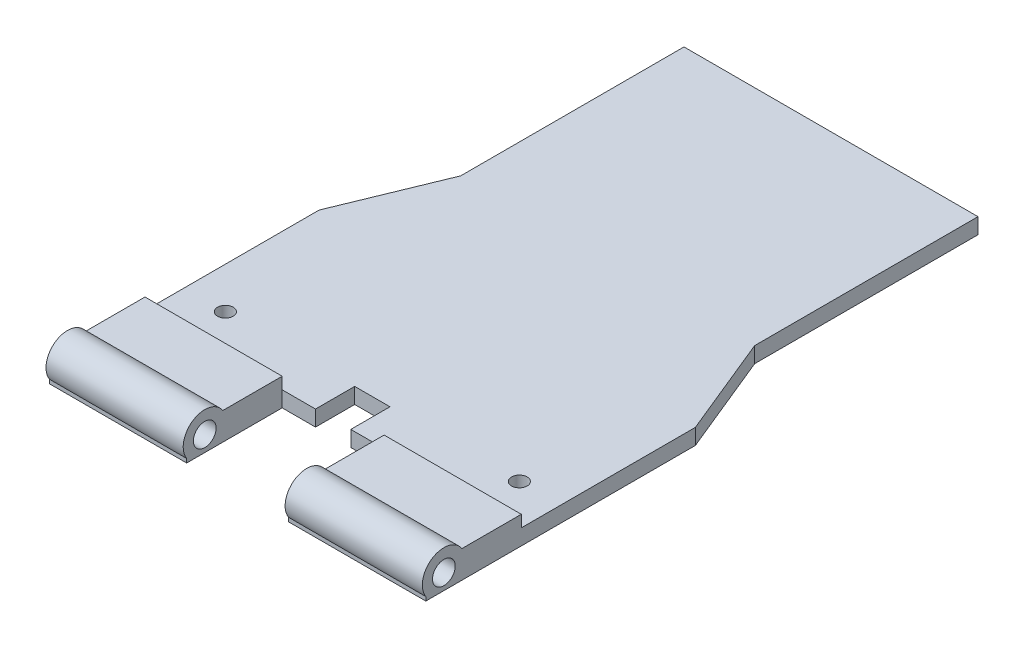
ISO-10303-21;
HEADER;
FILE_DESCRIPTION(('STEP AP214'),'2;1');
FILE_NAME('part.step','',(''),(''),'','','');
FILE_SCHEMA(('AUTOMOTIVE_DESIGN { 1 0 10303 214 1 1 1 1 }'));
ENDSEC;
DATA;
#1=APPLICATION_CONTEXT('core data for automotive mechanical design processes');
#2=APPLICATION_PROTOCOL_DEFINITION('international standard','automotive_design',2000,#1);
#3=PRODUCT_CONTEXT('',#1,'mechanical');
#4=PRODUCT('Part','Part','',(#3));
#5=PRODUCT_RELATED_PRODUCT_CATEGORY('part','',(#4));
#6=PRODUCT_DEFINITION_FORMATION('','',#4);
#7=PRODUCT_DEFINITION_CONTEXT('part definition',#1,'design');
#8=PRODUCT_DEFINITION('design','',#6,#7);
#9=PRODUCT_DEFINITION_SHAPE('','',#8);
#10=(LENGTH_UNIT() NAMED_UNIT(*) SI_UNIT(.MILLI.,.METRE.));
#11=(NAMED_UNIT(*) PLANE_ANGLE_UNIT() SI_UNIT($,.RADIAN.));
#12=(NAMED_UNIT(*) SI_UNIT($,.STERADIAN.) SOLID_ANGLE_UNIT());
#13=UNCERTAINTY_MEASURE_WITH_UNIT(LENGTH_MEASURE(1.E-05),#10,'distance_accuracy_value','');
#14=(GEOMETRIC_REPRESENTATION_CONTEXT(3) GLOBAL_UNCERTAINTY_ASSIGNED_CONTEXT((#13)) GLOBAL_UNIT_ASSIGNED_CONTEXT((#10,
#11,#12)) REPRESENTATION_CONTEXT('',''));
#15=CARTESIAN_POINT('',(0.,0.,0.));
#16=DIRECTION('',(0.,0.,1.));
#17=DIRECTION('',(1.,0.,0.));
#18=AXIS2_PLACEMENT_3D('',#15,#16,#17);
#19=CARTESIAN_POINT('',(0.,3.,0.));
#20=DIRECTION('',(0.,1.,0.));
#21=DIRECTION('',(0.,0.,1.));
#22=AXIS2_PLACEMENT_3D('',#19,#20,#21);
#23=PLANE('',#22);
#24=CARTESIAN_POINT('',(-24.5,3.,-33.));
#25=DIRECTION('',(0.,1.,0.));
#26=DIRECTION('',(0.,0.,1.));
#27=AXIS2_PLACEMENT_3D('',#24,#25,#26);
#28=CIRCLE('',#27,2.);
#29=CARTESIAN_POINT('',(-24.5,3.,-31.));
#30=VERTEX_POINT('',#29);
#31=EDGE_CURVE('E361',#30,#30,#28,.T.);
#32=ORIENTED_EDGE('',*,*,#31,.F.);
#33=EDGE_LOOP('',(#32));
#34=FACE_BOUND('',#33,.T.);
#35=CARTESIAN_POINT('',(50.5,3.,-33.));
#36=DIRECTION('',(0.,1.,0.));
#37=DIRECTION('',(0.,0.,1.));
#38=AXIS2_PLACEMENT_3D('',#35,#36,#37);
#39=CIRCLE('',#38,2.);
#40=CARTESIAN_POINT('',(50.5,3.,-31.));
#41=VERTEX_POINT('',#40);
#42=EDGE_CURVE('E212',#41,#41,#39,.T.);
#43=ORIENTED_EDGE('',*,*,#42,.F.);
#44=EDGE_LOOP('',(#43));
#45=FACE_BOUND('',#44,.T.);
#46=DIRECTION('',(1.,0.,0.));
#47=VECTOR('',#46,1.);
#48=CARTESIAN_POINT('',(17.5,3.,-23.));
#49=LINE('',#48,#47);
#50=CARTESIAN_POINT('',(17.5,3.,-23.));
#51=VERTEX_POINT('',#50);
#52=CARTESIAN_POINT('',(26.,3.,-23.));
#53=VERTEX_POINT('',#52);
#54=EDGE_CURVE('E323',#51,#53,#49,.T.);
#55=ORIENTED_EDGE('',*,*,#54,.T.);
#56=DIRECTION('',(-1.,0.,0.));
#57=VECTOR('',#56,1.);
#58=CARTESIAN_POINT('',(26.,3.,-23.));
#59=LINE('',#58,#57);
#60=CARTESIAN_POINT('',(61.,3.,-23.));
#61=VERTEX_POINT('',#60);
#62=EDGE_CURVE('E294',#61,#53,#59,.T.);
#63=ORIENTED_EDGE('',*,*,#62,.F.);
#64=DIRECTION('',(0.,0.,-1.));
#65=VECTOR('',#64,1.);
#66=CARTESIAN_POINT('',(61.,3.,0.));
#67=LINE('',#66,#65);
#68=CARTESIAN_POINT('',(61.,3.,-67.4061517647473));
#69=VERTEX_POINT('',#68);
#70=EDGE_CURVE('E326',#61,#69,#67,.T.);
#71=ORIENTED_EDGE('',*,*,#70,.T.);
#72=DIRECTION('',(-0.379179972178779,0.,-0.925322942922362));
#73=VECTOR('',#72,1.);
#74=CARTESIAN_POINT('',(61.,3.,-67.4061517647473));
#75=LINE('',#74,#73);
#76=CARTESIAN_POINT('',(50.5,3.,-93.0295802513761));
#77=VERTEX_POINT('',#76);
#78=EDGE_CURVE('E328',#69,#77,#75,.T.);
#79=ORIENTED_EDGE('',*,*,#78,.T.);
#80=DIRECTION('',(0.,0.,-1.));
#81=VECTOR('',#80,1.);
#82=CARTESIAN_POINT('',(50.5,3.,-93.0295802513761));
#83=LINE('',#82,#81);
#84=CARTESIAN_POINT('',(50.5,3.,-150.));
#85=VERTEX_POINT('',#84);
#86=EDGE_CURVE('E189',#77,#85,#83,.T.);
#87=ORIENTED_EDGE('',*,*,#86,.T.);
#88=DIRECTION('',(-1.,0.,0.));
#89=VECTOR('',#88,1.);
#90=CARTESIAN_POINT('',(50.5,3.,-150.));
#91=LINE('',#90,#89);
#92=CARTESIAN_POINT('',(-24.5,3.,-150.));
#93=VERTEX_POINT('',#92);
#94=EDGE_CURVE('E331',#85,#93,#91,.T.);
#95=ORIENTED_EDGE('',*,*,#94,.T.);
#96=DIRECTION('',(0.,0.,1.));
#97=VECTOR('',#96,1.);
#98=CARTESIAN_POINT('',(-24.5,3.,-150.));
#99=LINE('',#98,#97);
#100=CARTESIAN_POINT('',(-24.5,3.,-93.0295802513761));
#101=VERTEX_POINT('',#100);
#102=EDGE_CURVE('E333',#93,#101,#99,.T.);
#103=ORIENTED_EDGE('',*,*,#102,.T.);
#104=DIRECTION('',(-0.379179972178779,0.,0.925322942922362));
#105=VECTOR('',#104,1.);
#106=CARTESIAN_POINT('',(-35.,3.,-67.4061517647473));
#107=LINE('',#106,#105);
#108=CARTESIAN_POINT('',(-35.,3.,-67.4061517647473));
#109=VERTEX_POINT('',#108);
#110=EDGE_CURVE('E335',#101,#109,#107,.T.);
#111=ORIENTED_EDGE('',*,*,#110,.T.);
#112=DIRECTION('',(0.,0.,1.));
#113=VECTOR('',#112,1.);
#114=CARTESIAN_POINT('',(-35.,3.,-28.8013654618784));
#115=LINE('',#114,#113);
#116=CARTESIAN_POINT('',(-35.,3.,-23.));
#117=VERTEX_POINT('',#116);
#118=EDGE_CURVE('E337',#109,#117,#115,.T.);
#119=ORIENTED_EDGE('',*,*,#118,.T.);
#120=DIRECTION('',(-1.,0.,0.));
#121=VECTOR('',#120,1.);
#122=CARTESIAN_POINT('',(0.,3.,-23.));
#123=LINE('',#122,#121);
#124=CARTESIAN_POINT('',(0.,3.,-23.));
#125=VERTEX_POINT('',#124);
#126=EDGE_CURVE('E296',#125,#117,#123,.T.);
#127=ORIENTED_EDGE('',*,*,#126,.F.);
#128=DIRECTION('',(1.,0.,0.));
#129=VECTOR('',#128,1.);
#130=CARTESIAN_POINT('',(0.,3.,-23.));
#131=LINE('',#130,#129);
#132=CARTESIAN_POINT('',(8.5,3.,-23.));
#133=VERTEX_POINT('',#132);
#134=EDGE_CURVE('E315',#125,#133,#131,.T.);
#135=ORIENTED_EDGE('',*,*,#134,.T.);
#136=DIRECTION('',(0.,0.,-1.));
#137=VECTOR('',#136,1.);
#138=CARTESIAN_POINT('',(8.5,3.,-23.));
#139=LINE('',#138,#137);
#140=CARTESIAN_POINT('',(8.5,3.,-33.));
#141=VERTEX_POINT('',#140);
#142=EDGE_CURVE('E317',#133,#141,#139,.T.);
#143=ORIENTED_EDGE('',*,*,#142,.T.);
#144=DIRECTION('',(1.,0.,0.));
#145=VECTOR('',#144,1.);
#146=CARTESIAN_POINT('',(8.5,3.,-33.));
#147=LINE('',#146,#145);
#148=CARTESIAN_POINT('',(17.5,3.,-33.));
#149=VERTEX_POINT('',#148);
#150=EDGE_CURVE('E319',#141,#149,#147,.T.);
#151=ORIENTED_EDGE('',*,*,#150,.T.);
#152=DIRECTION('',(0.,0.,1.));
#153=VECTOR('',#152,1.);
#154=CARTESIAN_POINT('',(17.5,3.,-23.));
#155=LINE('',#154,#153);
#156=EDGE_CURVE('E321',#149,#51,#155,.T.);
#157=ORIENTED_EDGE('',*,*,#156,.T.);
#158=EDGE_LOOP('',(#55,#63,#71,#79,#87,#95,#103,#111,#119,#127,#135,#143,#151,#157));
#159=FACE_BOUND('',#158,.T.);
#160=ADVANCED_FACE('F41',(#34,#45,#159),#23,.T.);
#161=CARTESIAN_POINT('',(0.,3.,0.));
#162=DIRECTION('',(-1.,0.,0.));
#163=DIRECTION('',(0.,0.,1.));
#164=AXIS2_PLACEMENT_3D('',#161,#162,#163);
#165=PLANE('',#164);
#166=CARTESIAN_POINT('',(0.,3.,-3.24782672929978));
#167=DIRECTION('',(-1.,0.,0.));
#168=DIRECTION('',(0.,0.,1.));
#169=AXIS2_PLACEMENT_3D('',#166,#167,#168);
#170=CIRCLE('',#169,2.9);
#171=CARTESIAN_POINT('',(0.,3.,-0.347826729299784));
#172=VERTEX_POINT('',#171);
#173=EDGE_CURVE('E268',#172,#172,#170,.T.);
#174=ORIENTED_EDGE('',*,*,#173,.T.);
#175=EDGE_LOOP('',(#174));
#176=FACE_BOUND('',#175,.T.);
#177=CARTESIAN_POINT('',(0.,3.,-3.24782672929978));
#178=DIRECTION('',(-1.,0.,0.));
#179=DIRECTION('',(0.,0.,1.));
#180=AXIS2_PLACEMENT_3D('',#177,#178,#179);
#181=CIRCLE('',#180,5.5);
#182=CARTESIAN_POINT('',(0.,6.,-7.85759895794623));
#183=VERTEX_POINT('',#182);
#184=CARTESIAN_POINT('',(0.,0.,1.36194549934666));
#185=VERTEX_POINT('',#184);
#186=EDGE_CURVE('E281',#183,#185,#181,.F.);
#187=ORIENTED_EDGE('',*,*,#186,.T.);
#188=DIRECTION('',(0.,1.,0.));
#189=VECTOR('',#188,1.);
#190=CARTESIAN_POINT('',(0.,-1.,1.36194549934666));
#191=LINE('',#190,#189);
#192=CARTESIAN_POINT('',(0.,-1.,1.36194549934666));
#193=VERTEX_POINT('',#192);
#194=EDGE_CURVE('E252',#193,#185,#191,.T.);
#195=ORIENTED_EDGE('',*,*,#194,.F.);
#196=DIRECTION('',(0.,0.,1.));
#197=VECTOR('',#196,1.);
#198=CARTESIAN_POINT('',(0.,-1.,-23.));
#199=LINE('',#198,#197);
#200=CARTESIAN_POINT('',(0.,-1.,-23.));
#201=VERTEX_POINT('',#200);
#202=EDGE_CURVE('E236',#201,#193,#199,.T.);
#203=ORIENTED_EDGE('',*,*,#202,.F.);
#204=DIRECTION('',(0.,-1.,0.));
#205=VECTOR('',#204,1.);
#206=CARTESIAN_POINT('',(0.,3.,-23.));
#207=LINE('',#206,#205);
#208=EDGE_CURVE('E357',#125,#201,#207,.T.);
#209=ORIENTED_EDGE('',*,*,#208,.F.);
#210=DIRECTION('',(0.,-1.,0.));
#211=VECTOR('',#210,1.);
#212=CARTESIAN_POINT('',(0.,6.,-23.));
#213=LINE('',#212,#211);
#214=CARTESIAN_POINT('',(0.,6.,-23.));
#215=VERTEX_POINT('',#214);
#216=EDGE_CURVE('E312',#215,#125,#213,.T.);
#217=ORIENTED_EDGE('',*,*,#216,.F.);
#218=DIRECTION('',(0.,0.,-1.));
#219=VECTOR('',#218,1.);
#220=CARTESIAN_POINT('',(0.,6.,-23.));
#221=LINE('',#220,#219);
#222=EDGE_CURVE('E301',#183,#215,#221,.T.);
#223=ORIENTED_EDGE('',*,*,#222,.F.);
#224=EDGE_LOOP('',(#187,#195,#203,#209,#217,#223));
#225=FACE_BOUND('',#224,.T.);
#226=ADVANCED_FACE('F43',(#176,#225),#165,.F.);
#227=CARTESIAN_POINT('',(0.,3.,-23.));
#228=DIRECTION('',(0.,0.,-1.));
#229=DIRECTION('',(-1.,0.,0.));
#230=AXIS2_PLACEMENT_3D('',#227,#228,#229);
#231=PLANE('',#230);
#232=ORIENTED_EDGE('',*,*,#208,.T.);
#233=DIRECTION('',(-1.,0.,0.));
#234=VECTOR('',#233,1.);
#235=CARTESIAN_POINT('',(8.5,-1.,-23.));
#236=LINE('',#235,#234);
#237=CARTESIAN_POINT('',(8.5,-1.,-23.));
#238=VERTEX_POINT('',#237);
#239=EDGE_CURVE('E233',#238,#201,#236,.T.);
#240=ORIENTED_EDGE('',*,*,#239,.F.);
#241=DIRECTION('',(0.,-1.,0.));
#242=VECTOR('',#241,1.);
#243=CARTESIAN_POINT('',(8.5,3.,-23.));
#244=LINE('',#243,#242);
#245=EDGE_CURVE('E355',#133,#238,#244,.T.);
#246=ORIENTED_EDGE('',*,*,#245,.F.);
#247=ORIENTED_EDGE('',*,*,#134,.F.);
#248=EDGE_LOOP('',(#232,#240,#246,#247));
#249=FACE_BOUND('',#248,.T.);
#250=ADVANCED_FACE('F462',(#249),#231,.F.);
#251=CARTESIAN_POINT('',(8.5,3.,-23.));
#252=DIRECTION('',(-1.,0.,0.));
#253=DIRECTION('',(0.,0.,1.));
#254=AXIS2_PLACEMENT_3D('',#251,#252,#253);
#255=PLANE('',#254);
#256=ORIENTED_EDGE('',*,*,#245,.T.);
#257=DIRECTION('',(0.,0.,1.));
#258=VECTOR('',#257,1.);
#259=CARTESIAN_POINT('',(8.5,-1.,-33.));
#260=LINE('',#259,#258);
#261=CARTESIAN_POINT('',(8.5,-1.,-33.));
#262=VERTEX_POINT('',#261);
#263=EDGE_CURVE('E230',#262,#238,#260,.T.);
#264=ORIENTED_EDGE('',*,*,#263,.F.);
#265=DIRECTION('',(0.,-1.,0.));
#266=VECTOR('',#265,1.);
#267=CARTESIAN_POINT('',(8.5,3.,-33.));
#268=LINE('',#267,#266);
#269=EDGE_CURVE('E353',#141,#262,#268,.T.);
#270=ORIENTED_EDGE('',*,*,#269,.F.);
#271=ORIENTED_EDGE('',*,*,#142,.F.);
#272=EDGE_LOOP('',(#256,#264,#270,#271));
#273=FACE_BOUND('',#272,.T.);
#274=ADVANCED_FACE('F459',(#273),#255,.F.);
#275=CARTESIAN_POINT('',(8.5,3.,-33.));
#276=DIRECTION('',(0.,0.,-1.));
#277=DIRECTION('',(-1.,0.,0.));
#278=AXIS2_PLACEMENT_3D('',#275,#276,#277);
#279=PLANE('',#278);
#280=ORIENTED_EDGE('',*,*,#269,.T.);
#281=DIRECTION('',(-1.,0.,0.));
#282=VECTOR('',#281,1.);
#283=CARTESIAN_POINT('',(17.5,-1.,-33.));
#284=LINE('',#283,#282);
#285=CARTESIAN_POINT('',(17.5,-1.,-33.));
#286=VERTEX_POINT('',#285);
#287=EDGE_CURVE('E227',#286,#262,#284,.T.);
#288=ORIENTED_EDGE('',*,*,#287,.F.);
#289=DIRECTION('',(0.,-1.,0.));
#290=VECTOR('',#289,1.);
#291=CARTESIAN_POINT('',(17.5,3.,-33.));
#292=LINE('',#291,#290);
#293=EDGE_CURVE('E351',#149,#286,#292,.T.);
#294=ORIENTED_EDGE('',*,*,#293,.F.);
#295=ORIENTED_EDGE('',*,*,#150,.F.);
#296=EDGE_LOOP('',(#280,#288,#294,#295));
#297=FACE_BOUND('',#296,.T.);
#298=ADVANCED_FACE('F455',(#297),#279,.F.);
#299=CARTESIAN_POINT('',(17.5,3.,-23.));
#300=DIRECTION('',(1.,0.,0.));
#301=DIRECTION('',(0.,0.,-1.));
#302=AXIS2_PLACEMENT_3D('',#299,#300,#301);
#303=PLANE('',#302);
#304=ORIENTED_EDGE('',*,*,#293,.T.);
#305=DIRECTION('',(0.,0.,-1.));
#306=VECTOR('',#305,1.);
#307=CARTESIAN_POINT('',(17.5,-1.,-23.));
#308=LINE('',#307,#306);
#309=CARTESIAN_POINT('',(17.5,-1.,-23.));
#310=VERTEX_POINT('',#309);
#311=EDGE_CURVE('E224',#310,#286,#308,.T.);
#312=ORIENTED_EDGE('',*,*,#311,.F.);
#313=DIRECTION('',(0.,-1.,0.));
#314=VECTOR('',#313,1.);
#315=CARTESIAN_POINT('',(17.5,3.,-23.));
#316=LINE('',#315,#314);
#317=EDGE_CURVE('E349',#51,#310,#316,.T.);
#318=ORIENTED_EDGE('',*,*,#317,.F.);
#319=ORIENTED_EDGE('',*,*,#156,.F.);
#320=EDGE_LOOP('',(#304,#312,#318,#319));
#321=FACE_BOUND('',#320,.T.);
#322=ADVANCED_FACE('F452',(#321),#303,.F.);
#323=CARTESIAN_POINT('',(17.5,3.,-23.));
#324=DIRECTION('',(0.,0.,-1.));
#325=DIRECTION('',(-1.,0.,0.));
#326=AXIS2_PLACEMENT_3D('',#323,#324,#325);
#327=PLANE('',#326);
#328=ORIENTED_EDGE('',*,*,#317,.T.);
#329=DIRECTION('',(-1.,0.,0.));
#330=VECTOR('',#329,1.);
#331=CARTESIAN_POINT('',(26.,-1.,-23.));
#332=LINE('',#331,#330);
#333=CARTESIAN_POINT('',(26.,-1.,-23.));
#334=VERTEX_POINT('',#333);
#335=EDGE_CURVE('E221',#334,#310,#332,.T.);
#336=ORIENTED_EDGE('',*,*,#335,.F.);
#337=DIRECTION('',(0.,-1.,0.));
#338=VECTOR('',#337,1.);
#339=CARTESIAN_POINT('',(26.,3.,-23.));
#340=LINE('',#339,#338);
#341=EDGE_CURVE('E347',#53,#334,#340,.T.);
#342=ORIENTED_EDGE('',*,*,#341,.F.);
#343=ORIENTED_EDGE('',*,*,#54,.F.);
#344=EDGE_LOOP('',(#328,#336,#342,#343));
#345=FACE_BOUND('',#344,.T.);
#346=ADVANCED_FACE('F384',(#345),#327,.F.);
#347=CARTESIAN_POINT('',(26.,3.,-23.));
#348=DIRECTION('',(1.,0.,0.));
#349=DIRECTION('',(0.,0.,-1.));
#350=AXIS2_PLACEMENT_3D('',#347,#348,#349);
#351=PLANE('',#350);
#352=CARTESIAN_POINT('',(26.,3.,-3.24782672929978));
#353=DIRECTION('',(1.,0.,0.));
#354=DIRECTION('',(0.,0.,-1.));
#355=AXIS2_PLACEMENT_3D('',#352,#353,#354);
#356=CIRCLE('',#355,2.9);
#357=CARTESIAN_POINT('',(26.,3.,-6.14782672929978));
#358=VERTEX_POINT('',#357);
#359=EDGE_CURVE('E265',#358,#358,#356,.T.);
#360=ORIENTED_EDGE('',*,*,#359,.T.);
#361=EDGE_LOOP('',(#360));
#362=FACE_BOUND('',#361,.T.);
#363=ORIENTED_EDGE('',*,*,#341,.T.);
#364=DIRECTION('',(0.,0.,-1.));
#365=VECTOR('',#364,1.);
#366=CARTESIAN_POINT('',(26.,-1.,1.36194549934664));
#367=LINE('',#366,#365);
#368=CARTESIAN_POINT('',(26.,-1.,1.36194549934664));
#369=VERTEX_POINT('',#368);
#370=EDGE_CURVE('E218',#369,#334,#367,.T.);
#371=ORIENTED_EDGE('',*,*,#370,.F.);
#372=DIRECTION('',(0.,1.,0.));
#373=VECTOR('',#372,1.);
#374=CARTESIAN_POINT('',(26.,-1.,1.36194549934664));
#375=LINE('',#374,#373);
#376=CARTESIAN_POINT('',(26.,0.,1.36194549934664));
#377=VERTEX_POINT('',#376);
#378=EDGE_CURVE('E254',#369,#377,#375,.T.);
#379=ORIENTED_EDGE('',*,*,#378,.T.);
#380=CARTESIAN_POINT('',(26.,3.,-3.24782672929978));
#381=DIRECTION('',(1.,0.,0.));
#382=DIRECTION('',(0.,0.,-1.));
#383=AXIS2_PLACEMENT_3D('',#380,#381,#382);
#384=CIRCLE('',#383,5.49999999999999);
#385=CARTESIAN_POINT('',(26.,6.,-7.85759895794622));
#386=VERTEX_POINT('',#385);
#387=EDGE_CURVE('E272',#377,#386,#384,.F.);
#388=ORIENTED_EDGE('',*,*,#387,.T.);
#389=DIRECTION('',(0.,0.,1.));
#390=VECTOR('',#389,1.);
#391=CARTESIAN_POINT('',(26.,6.,-23.));
#392=LINE('',#391,#390);
#393=CARTESIAN_POINT('',(26.,6.,-23.));
#394=VERTEX_POINT('',#393);
#395=EDGE_CURVE('E61',#394,#386,#392,.T.);
#396=ORIENTED_EDGE('',*,*,#395,.F.);
#397=DIRECTION('',(0.,-1.,0.));
#398=VECTOR('',#397,1.);
#399=CARTESIAN_POINT('',(26.,6.,-23.));
#400=LINE('',#399,#398);
#401=EDGE_CURVE('E290',#394,#53,#400,.T.);
#402=ORIENTED_EDGE('',*,*,#401,.T.);
#403=EDGE_LOOP('',(#363,#371,#379,#388,#396,#402));
#404=FACE_BOUND('',#403,.T.);
#405=ADVANCED_FACE('F387',(#362,#404),#351,.F.);
#406=CARTESIAN_POINT('',(61.,3.,-28.8013654618784));
#407=DIRECTION('',(-1.,0.,0.));
#408=DIRECTION('',(0.,0.,1.));
#409=AXIS2_PLACEMENT_3D('',#406,#407,#408);
#410=PLANE('',#409);
#411=CARTESIAN_POINT('',(61.,3.,-3.24782672929978));
#412=DIRECTION('',(-1.,0.,0.));
#413=DIRECTION('',(0.,0.,1.));
#414=AXIS2_PLACEMENT_3D('',#411,#412,#413);
#415=CIRCLE('',#414,2.9);
#416=CARTESIAN_POINT('',(61.,3.,-0.347826729299784));
#417=VERTEX_POINT('',#416);
#418=EDGE_CURVE('E262',#417,#417,#415,.F.);
#419=ORIENTED_EDGE('',*,*,#418,.F.);
#420=EDGE_LOOP('',(#419));
#421=FACE_BOUND('',#420,.T.);
#422=CARTESIAN_POINT('',(61.,3.,-3.24782672929979));
#423=DIRECTION('',(1.,0.,0.));
#424=DIRECTION('',(0.,0.,-1.));
#425=AXIS2_PLACEMENT_3D('',#422,#423,#424);
#426=CIRCLE('',#425,5.49999999999999);
#427=CARTESIAN_POINT('',(61.,6.,-7.85759895794623));
#428=VERTEX_POINT('',#427);
#429=CARTESIAN_POINT('',(61.,0.,1.36194549934665));
#430=VERTEX_POINT('',#429);
#431=EDGE_CURVE('E271',#428,#430,#426,.T.);
#432=ORIENTED_EDGE('',*,*,#431,.T.);
#433=DIRECTION('',(0.,1.,0.));
#434=VECTOR('',#433,1.);
#435=CARTESIAN_POINT('',(61.,-1.,1.36194549934663));
#436=LINE('',#435,#434);
#437=CARTESIAN_POINT('',(61.,-1.,1.36194549934663));
#438=VERTEX_POINT('',#437);
#439=EDGE_CURVE('E257',#438,#430,#436,.T.);
#440=ORIENTED_EDGE('',*,*,#439,.F.);
#441=DIRECTION('',(0.,0.,1.));
#442=VECTOR('',#441,1.);
#443=CARTESIAN_POINT('',(61.,-1.,-67.4061517647473));
#444=LINE('',#443,#442);
#445=CARTESIAN_POINT('',(61.,-1.,-67.4061517647473));
#446=VERTEX_POINT('',#445);
#447=EDGE_CURVE('E201',#446,#438,#444,.T.);
#448=ORIENTED_EDGE('',*,*,#447,.F.);
#449=DIRECTION('',(0.,-1.,0.));
#450=VECTOR('',#449,1.);
#451=CARTESIAN_POINT('',(61.,3.,-67.4061517647473));
#452=LINE('',#451,#450);
#453=EDGE_CURVE('E192',#69,#446,#452,.T.);
#454=ORIENTED_EDGE('',*,*,#453,.F.);
#455=ORIENTED_EDGE('',*,*,#70,.F.);
#456=DIRECTION('',(0.,-1.,0.));
#457=VECTOR('',#456,1.);
#458=CARTESIAN_POINT('',(61.,6.,-23.));
#459=LINE('',#458,#457);
#460=CARTESIAN_POINT('',(61.,6.,-23.));
#461=VERTEX_POINT('',#460);
#462=EDGE_CURVE('E284',#461,#61,#459,.T.);
#463=ORIENTED_EDGE('',*,*,#462,.F.);
#464=DIRECTION('',(0.,0.,-1.));
#465=VECTOR('',#464,1.);
#466=CARTESIAN_POINT('',(61.,6.,-23.));
#467=LINE('',#466,#465);
#468=EDGE_CURVE('E298',#428,#461,#467,.T.);
#469=ORIENTED_EDGE('',*,*,#468,.F.);
#470=EDGE_LOOP('',(#432,#440,#448,#454,#455,#463,#469));
#471=FACE_BOUND('',#470,.T.);
#472=ADVANCED_FACE('F400',(#421,#471),#410,.F.);
#473=CARTESIAN_POINT('',(61.,3.,-67.4061517647473));
#474=DIRECTION('',(-0.925322942922362,0.,0.379179972178779));
#475=DIRECTION('',(0.379179972178779,0.,0.925322942922362));
#476=AXIS2_PLACEMENT_3D('',#473,#474,#475);
#477=PLANE('',#476);
#478=ORIENTED_EDGE('',*,*,#453,.T.);
#479=DIRECTION('',(0.379179972178779,0.,0.925322942922362));
#480=VECTOR('',#479,1.);
#481=CARTESIAN_POINT('',(50.5,-1.,-93.0295802513761));
#482=LINE('',#481,#480);
#483=CARTESIAN_POINT('',(50.5,-1.,-93.0295802513761));
#484=VERTEX_POINT('',#483);
#485=EDGE_CURVE('E196',#484,#446,#482,.T.);
#486=ORIENTED_EDGE('',*,*,#485,.F.);
#487=DIRECTION('',(0.,-1.,0.));
#488=VECTOR('',#487,1.);
#489=CARTESIAN_POINT('',(50.5,3.,-93.0295802513761));
#490=LINE('',#489,#488);
#491=EDGE_CURVE('E183',#77,#484,#490,.T.);
#492=ORIENTED_EDGE('',*,*,#491,.F.);
#493=ORIENTED_EDGE('',*,*,#78,.F.);
#494=EDGE_LOOP('',(#478,#486,#492,#493));
#495=FACE_BOUND('',#494,.T.);
#496=ADVANCED_FACE('F197',(#495),#477,.F.);
#497=CARTESIAN_POINT('',(50.5,3.,-93.0295802513761));
#498=DIRECTION('',(-1.,0.,0.));
#499=DIRECTION('',(0.,0.,1.));
#500=AXIS2_PLACEMENT_3D('',#497,#498,#499);
#501=PLANE('',#500);
#502=ORIENTED_EDGE('',*,*,#491,.T.);
#503=DIRECTION('',(0.,0.,1.));
#504=VECTOR('',#503,1.);
#505=CARTESIAN_POINT('',(50.5,-1.,-150.));
#506=LINE('',#505,#504);
#507=CARTESIAN_POINT('',(50.5,-1.,-150.));
#508=VERTEX_POINT('',#507);
#509=EDGE_CURVE('E188',#508,#484,#506,.T.);
#510=ORIENTED_EDGE('',*,*,#509,.F.);
#511=DIRECTION('',(0.,-1.,0.));
#512=VECTOR('',#511,1.);
#513=CARTESIAN_POINT('',(50.5,3.,-150.));
#514=LINE('',#513,#512);
#515=EDGE_CURVE('E193',#85,#508,#514,.T.);
#516=ORIENTED_EDGE('',*,*,#515,.F.);
#517=ORIENTED_EDGE('',*,*,#86,.F.);
#518=EDGE_LOOP('',(#502,#510,#516,#517));
#519=FACE_BOUND('',#518,.T.);
#520=ADVANCED_FACE('F185',(#519),#501,.F.);
#521=CARTESIAN_POINT('',(50.5,3.,-150.));
#522=DIRECTION('',(0.,0.,1.));
#523=DIRECTION('',(1.,0.,0.));
#524=AXIS2_PLACEMENT_3D('',#521,#522,#523);
#525=PLANE('',#524);
#526=ORIENTED_EDGE('',*,*,#515,.T.);
#527=DIRECTION('',(1.,0.,0.));
#528=VECTOR('',#527,1.);
#529=CARTESIAN_POINT('',(-24.5,-1.,-150.));
#530=LINE('',#529,#528);
#531=CARTESIAN_POINT('',(-24.5,-1.,-150.));
#532=VERTEX_POINT('',#531);
#533=EDGE_CURVE('E207',#532,#508,#530,.T.);
#534=ORIENTED_EDGE('',*,*,#533,.F.);
#535=DIRECTION('',(0.,-1.,0.));
#536=VECTOR('',#535,1.);
#537=CARTESIAN_POINT('',(-24.5,3.,-150.));
#538=LINE('',#537,#536);
#539=EDGE_CURVE('E343',#93,#532,#538,.T.);
#540=ORIENTED_EDGE('',*,*,#539,.F.);
#541=ORIENTED_EDGE('',*,*,#94,.F.);
#542=EDGE_LOOP('',(#526,#534,#540,#541));
#543=FACE_BOUND('',#542,.T.);
#544=ADVANCED_FACE('F435',(#543),#525,.F.);
#545=CARTESIAN_POINT('',(-24.5,3.,-150.));
#546=DIRECTION('',(1.,0.,0.));
#547=DIRECTION('',(0.,0.,-1.));
#548=AXIS2_PLACEMENT_3D('',#545,#546,#547);
#549=PLANE('',#548);
#550=ORIENTED_EDGE('',*,*,#539,.T.);
#551=DIRECTION('',(0.,0.,-1.));
#552=VECTOR('',#551,1.);
#553=CARTESIAN_POINT('',(-24.5,-1.,-93.0295802513761));
#554=LINE('',#553,#552);
#555=CARTESIAN_POINT('',(-24.5,-1.,-93.0295802513761));
#556=VERTEX_POINT('',#555);
#557=EDGE_CURVE('E246',#556,#532,#554,.T.);
#558=ORIENTED_EDGE('',*,*,#557,.F.);
#559=DIRECTION('',(0.,-1.,0.));
#560=VECTOR('',#559,1.);
#561=CARTESIAN_POINT('',(-24.5,3.,-93.0295802513761));
#562=LINE('',#561,#560);
#563=EDGE_CURVE('E341',#101,#556,#562,.T.);
#564=ORIENTED_EDGE('',*,*,#563,.F.);
#565=ORIENTED_EDGE('',*,*,#102,.F.);
#566=EDGE_LOOP('',(#550,#558,#564,#565));
#567=FACE_BOUND('',#566,.T.);
#568=ADVANCED_FACE('F431',(#567),#549,.F.);
#569=CARTESIAN_POINT('',(-35.,3.,-67.4061517647473));
#570=DIRECTION('',(0.925322942922362,0.,0.379179972178779));
#571=DIRECTION('',(0.379179972178779,0.,-0.925322942922362));
#572=AXIS2_PLACEMENT_3D('',#569,#570,#571);
#573=PLANE('',#572);
#574=ORIENTED_EDGE('',*,*,#563,.T.);
#575=DIRECTION('',(0.379179972178779,0.,-0.925322942922362));
#576=VECTOR('',#575,1.);
#577=CARTESIAN_POINT('',(-35.,-1.,-67.4061517647473));
#578=LINE('',#577,#576);
#579=CARTESIAN_POINT('',(-35.,-1.,-67.4061517647473));
#580=VERTEX_POINT('',#579);
#581=EDGE_CURVE('E243',#580,#556,#578,.T.);
#582=ORIENTED_EDGE('',*,*,#581,.F.);
#583=DIRECTION('',(0.,-1.,0.));
#584=VECTOR('',#583,1.);
#585=CARTESIAN_POINT('',(-35.,3.,-67.4061517647473));
#586=LINE('',#585,#584);
#587=EDGE_CURVE('E339',#109,#580,#586,.T.);
#588=ORIENTED_EDGE('',*,*,#587,.F.);
#589=ORIENTED_EDGE('',*,*,#110,.F.);
#590=EDGE_LOOP('',(#574,#582,#588,#589));
#591=FACE_BOUND('',#590,.T.);
#592=ADVANCED_FACE('F427',(#591),#573,.F.);
#593=CARTESIAN_POINT('',(-35.,3.,-28.8013654618784));
#594=DIRECTION('',(1.,0.,0.));
#595=DIRECTION('',(0.,0.,-1.));
#596=AXIS2_PLACEMENT_3D('',#593,#594,#595);
#597=PLANE('',#596);
#598=CARTESIAN_POINT('',(-35.,3.,-3.24782672929978));
#599=DIRECTION('',(-1.,0.,0.));
#600=DIRECTION('',(0.,0.,1.));
#601=AXIS2_PLACEMENT_3D('',#598,#599,#600);
#602=CIRCLE('',#601,2.9);
#603=CARTESIAN_POINT('',(-35.,3.,-0.347826729299784));
#604=VERTEX_POINT('',#603);
#605=EDGE_CURVE('E259',#604,#604,#602,.T.);
#606=ORIENTED_EDGE('',*,*,#605,.F.);
#607=EDGE_LOOP('',(#606));
#608=FACE_BOUND('',#607,.T.);
#609=ORIENTED_EDGE('',*,*,#587,.T.);
#610=DIRECTION('',(0.,0.,-1.));
#611=VECTOR('',#610,1.);
#612=CARTESIAN_POINT('',(-35.,-1.,1.36194549934666));
#613=LINE('',#612,#611);
#614=CARTESIAN_POINT('',(-35.,-1.,1.36194549934666));
#615=VERTEX_POINT('',#614);
#616=EDGE_CURVE('E240',#615,#580,#613,.T.);
#617=ORIENTED_EDGE('',*,*,#616,.F.);
#618=DIRECTION('',(0.,1.,0.));
#619=VECTOR('',#618,1.);
#620=CARTESIAN_POINT('',(-35.,-1.,1.36194549934666));
#621=LINE('',#620,#619);
#622=CARTESIAN_POINT('',(-35.,0.,1.36194549934666));
#623=VERTEX_POINT('',#622);
#624=EDGE_CURVE('E249',#615,#623,#621,.T.);
#625=ORIENTED_EDGE('',*,*,#624,.T.);
#626=CARTESIAN_POINT('',(-35.,3.,-3.24782672929978));
#627=DIRECTION('',(-1.,0.,0.));
#628=DIRECTION('',(0.,0.,1.));
#629=AXIS2_PLACEMENT_3D('',#626,#627,#628);
#630=CIRCLE('',#629,5.5);
#631=CARTESIAN_POINT('',(-35.,6.,-7.85759895794623));
#632=VERTEX_POINT('',#631);
#633=EDGE_CURVE('E275',#623,#632,#630,.T.);
#634=ORIENTED_EDGE('',*,*,#633,.T.);
#635=DIRECTION('',(0.,0.,1.));
#636=VECTOR('',#635,1.);
#637=CARTESIAN_POINT('',(-35.,6.,-23.));
#638=LINE('',#637,#636);
#639=CARTESIAN_POINT('',(-35.,6.,-23.));
#640=VERTEX_POINT('',#639);
#641=EDGE_CURVE('E305',#640,#632,#638,.T.);
#642=ORIENTED_EDGE('',*,*,#641,.F.);
#643=DIRECTION('',(0.,-1.,0.));
#644=VECTOR('',#643,1.);
#645=CARTESIAN_POINT('',(-35.,6.,-23.));
#646=LINE('',#645,#644);
#647=EDGE_CURVE('E307',#640,#117,#646,.T.);
#648=ORIENTED_EDGE('',*,*,#647,.T.);
#649=ORIENTED_EDGE('',*,*,#118,.F.);
#650=EDGE_LOOP('',(#609,#617,#625,#634,#642,#648,#649));
#651=FACE_BOUND('',#650,.T.);
#652=ADVANCED_FACE('F422',(#608,#651),#597,.F.);
#653=CARTESIAN_POINT('',(0.,6.,-23.));
#654=DIRECTION('',(0.,0.,1.));
#655=DIRECTION('',(1.,0.,0.));
#656=AXIS2_PLACEMENT_3D('',#653,#654,#655);
#657=PLANE('',#656);
#658=ORIENTED_EDGE('',*,*,#126,.T.);
#659=ORIENTED_EDGE('',*,*,#647,.F.);
#660=DIRECTION('',(-1.,0.,0.));
#661=VECTOR('',#660,1.);
#662=CARTESIAN_POINT('',(0.,6.,-23.));
#663=LINE('',#662,#661);
#664=EDGE_CURVE('E303',#215,#640,#663,.T.);
#665=ORIENTED_EDGE('',*,*,#664,.F.);
#666=ORIENTED_EDGE('',*,*,#216,.T.);
#667=EDGE_LOOP('',(#658,#659,#665,#666));
#668=FACE_BOUND('',#667,.T.);
#669=ADVANCED_FACE('F416',(#668),#657,.F.);
#670=CARTESIAN_POINT('',(0.,6.,0.));
#671=DIRECTION('',(0.,-1.,0.));
#672=DIRECTION('',(0.,0.,-1.));
#673=AXIS2_PLACEMENT_3D('',#670,#671,#672);
#674=PLANE('',#673);
#675=ORIENTED_EDGE('',*,*,#641,.T.);
#676=DIRECTION('',(-1.,0.,0.));
#677=VECTOR('',#676,1.);
#678=CARTESIAN_POINT('',(13.9014387744578,6.,-7.85759895794623));
#679=LINE('',#678,#677);
#680=EDGE_CURVE('E50',#632,#183,#679,.F.);
#681=ORIENTED_EDGE('',*,*,#680,.T.);
#682=ORIENTED_EDGE('',*,*,#222,.T.);
#683=ORIENTED_EDGE('',*,*,#664,.T.);
#684=EDGE_LOOP('',(#675,#681,#682,#683));
#685=FACE_BOUND('',#684,.T.);
#686=ADVANCED_FACE('F407',(#685),#674,.F.);
#687=CARTESIAN_POINT('',(26.,6.,-23.));
#688=DIRECTION('',(0.,0.,1.));
#689=DIRECTION('',(1.,0.,0.));
#690=AXIS2_PLACEMENT_3D('',#687,#688,#689);
#691=PLANE('',#690);
#692=ORIENTED_EDGE('',*,*,#62,.T.);
#693=ORIENTED_EDGE('',*,*,#401,.F.);
#694=DIRECTION('',(-1.,0.,0.));
#695=VECTOR('',#694,1.);
#696=CARTESIAN_POINT('',(26.,6.,-23.));
#697=LINE('',#696,#695);
#698=EDGE_CURVE('E293',#461,#394,#697,.T.);
#699=ORIENTED_EDGE('',*,*,#698,.F.);
#700=ORIENTED_EDGE('',*,*,#462,.T.);
#701=EDGE_LOOP('',(#692,#693,#699,#700));
#702=FACE_BOUND('',#701,.T.);
#703=ADVANCED_FACE('F405',(#702),#691,.F.);
#704=CARTESIAN_POINT('',(0.,6.,0.));
#705=DIRECTION('',(0.,1.,0.));
#706=DIRECTION('',(0.,0.,1.));
#707=AXIS2_PLACEMENT_3D('',#704,#705,#706);
#708=PLANE('',#707);
#709=DIRECTION('',(1.,0.,0.));
#710=VECTOR('',#709,1.);
#711=CARTESIAN_POINT('',(12.0985612255422,6.,-7.85759895794622));
#712=LINE('',#711,#710);
#713=EDGE_CURVE('E11',#428,#386,#712,.F.);
#714=ORIENTED_EDGE('',*,*,#713,.F.);
#715=ORIENTED_EDGE('',*,*,#468,.T.);
#716=ORIENTED_EDGE('',*,*,#698,.T.);
#717=ORIENTED_EDGE('',*,*,#395,.T.);
#718=EDGE_LOOP('',(#714,#715,#716,#717));
#719=FACE_BOUND('',#718,.T.);
#720=ADVANCED_FACE('F403',(#719),#708,.T.);
#721=CARTESIAN_POINT('',(13.9014387744578,3.,-3.24782672929978));
#722=DIRECTION('',(-1.,0.,0.));
#723=DIRECTION('',(0.,0.,1.));
#724=AXIS2_PLACEMENT_3D('',#721,#722,#723);
#725=CYLINDRICAL_SURFACE('',#724,5.5);
#726=ORIENTED_EDGE('',*,*,#680,.F.);
#727=ORIENTED_EDGE('',*,*,#633,.F.);
#728=DIRECTION('',(-1.,0.,0.));
#729=VECTOR('',#728,1.);
#730=CARTESIAN_POINT('',(13.9014387744578,0.,1.36194549934666));
#731=LINE('',#730,#729);
#732=EDGE_CURVE('E285',#185,#623,#731,.T.);
#733=ORIENTED_EDGE('',*,*,#732,.F.);
#734=ORIENTED_EDGE('',*,*,#186,.F.);
#735=EDGE_LOOP('',(#726,#727,#733,#734));
#736=FACE_BOUND('',#735,.T.);
#737=ADVANCED_FACE('F414',(#736),#725,.T.);
#738=CARTESIAN_POINT('',(12.0985612255422,3.,-3.24782672929978));
#739=DIRECTION('',(1.,0.,0.));
#740=DIRECTION('',(0.,0.,-1.));
#741=AXIS2_PLACEMENT_3D('',#738,#739,#740);
#742=CYLINDRICAL_SURFACE('',#741,5.49999999999999);
#743=ORIENTED_EDGE('',*,*,#431,.F.);
#744=ORIENTED_EDGE('',*,*,#713,.T.);
#745=ORIENTED_EDGE('',*,*,#387,.F.);
#746=DIRECTION('',(1.,0.,0.));
#747=VECTOR('',#746,1.);
#748=CARTESIAN_POINT('',(12.0985612255422,0.,1.36194549934666));
#749=LINE('',#748,#747);
#750=EDGE_CURVE('E276',#377,#430,#749,.T.);
#751=ORIENTED_EDGE('',*,*,#750,.T.);
#752=EDGE_LOOP('',(#743,#744,#745,#751));
#753=FACE_BOUND('',#752,.T.);
#754=ADVANCED_FACE('F398',(#753),#742,.T.);
#755=CARTESIAN_POINT('',(69.2024386617639,3.,-3.24782672929978));
#756=DIRECTION('',(-1.,0.,0.));
#757=DIRECTION('',(0.,0.,1.));
#758=AXIS2_PLACEMENT_3D('',#755,#756,#757);
#759=CYLINDRICAL_SURFACE('',#758,2.9);
#760=ORIENTED_EDGE('',*,*,#605,.T.);
#761=EDGE_LOOP('',(#760));
#762=FACE_BOUND('',#761,.T.);
#763=ORIENTED_EDGE('',*,*,#173,.F.);
#764=EDGE_LOOP('',(#763));
#765=FACE_BOUND('',#764,.T.);
#766=ADVANCED_FACE('F506',(#762,#765),#759,.F.);
#767=ORIENTED_EDGE('',*,*,#418,.T.);
#768=EDGE_LOOP('',(#767));
#769=FACE_BOUND('',#768,.T.);
#770=ORIENTED_EDGE('',*,*,#359,.F.);
#771=EDGE_LOOP('',(#770));
#772=FACE_BOUND('',#771,.T.);
#773=ADVANCED_FACE('F511',(#769,#772),#759,.F.);
#774=CARTESIAN_POINT('',(61.,-1.,1.36194549934663));
#775=DIRECTION('',(0.,0.,-1.));
#776=DIRECTION('',(-1.,0.,0.));
#777=AXIS2_PLACEMENT_3D('',#774,#775,#776);
#778=PLANE('',#777);
#779=ORIENTED_EDGE('',*,*,#750,.F.);
#780=ORIENTED_EDGE('',*,*,#378,.F.);
#781=DIRECTION('',(-1.,0.,0.));
#782=VECTOR('',#781,1.);
#783=CARTESIAN_POINT('',(61.,-1.,1.36194549934663));
#784=LINE('',#783,#782);
#785=EDGE_CURVE('E216',#438,#369,#784,.T.);
#786=ORIENTED_EDGE('',*,*,#785,.F.);
#787=ORIENTED_EDGE('',*,*,#439,.T.);
#788=EDGE_LOOP('',(#779,#780,#786,#787));
#789=FACE_BOUND('',#788,.T.);
#790=ADVANCED_FACE('F394',(#789),#778,.F.);
#791=CARTESIAN_POINT('',(0.,-1.,1.36194549934666));
#792=DIRECTION('',(0.,0.,-1.));
#793=DIRECTION('',(-1.,0.,0.));
#794=AXIS2_PLACEMENT_3D('',#791,#792,#793);
#795=PLANE('',#794);
#796=ORIENTED_EDGE('',*,*,#732,.T.);
#797=ORIENTED_EDGE('',*,*,#624,.F.);
#798=DIRECTION('',(-1.,0.,0.));
#799=VECTOR('',#798,1.);
#800=CARTESIAN_POINT('',(0.,-1.,1.36194549934666));
#801=LINE('',#800,#799);
#802=EDGE_CURVE('E238',#193,#615,#801,.T.);
#803=ORIENTED_EDGE('',*,*,#802,.F.);
#804=ORIENTED_EDGE('',*,*,#194,.T.);
#805=EDGE_LOOP('',(#796,#797,#803,#804));
#806=FACE_BOUND('',#805,.T.);
#807=ADVANCED_FACE('F484',(#806),#795,.F.);
#808=CARTESIAN_POINT('',(0.,-1.,0.));
#809=DIRECTION('',(0.,-1.,0.));
#810=DIRECTION('',(0.,0.,-1.));
#811=AXIS2_PLACEMENT_3D('',#808,#809,#810);
#812=PLANE('',#811);
#813=CARTESIAN_POINT('',(-24.5,-1.,-33.));
#814=DIRECTION('',(0.,-1.,0.));
#815=DIRECTION('',(0.,0.,-1.));
#816=AXIS2_PLACEMENT_3D('',#813,#814,#815);
#817=CIRCLE('',#816,2.);
#818=CARTESIAN_POINT('',(-24.5,-1.,-35.));
#819=VERTEX_POINT('',#818);
#820=EDGE_CURVE('E45',#819,#819,#817,.T.);
#821=ORIENTED_EDGE('',*,*,#820,.F.);
#822=EDGE_LOOP('',(#821));
#823=FACE_BOUND('',#822,.T.);
#824=CARTESIAN_POINT('',(50.5,-1.,-33.));
#825=DIRECTION('',(0.,-1.,0.));
#826=DIRECTION('',(0.,0.,-1.));
#827=AXIS2_PLACEMENT_3D('',#824,#825,#826);
#828=CIRCLE('',#827,2.);
#829=CARTESIAN_POINT('',(50.5,-1.,-35.));
#830=VERTEX_POINT('',#829);
#831=EDGE_CURVE('E210',#830,#830,#828,.T.);
#832=ORIENTED_EDGE('',*,*,#831,.F.);
#833=EDGE_LOOP('',(#832));
#834=FACE_BOUND('',#833,.T.);
#835=ORIENTED_EDGE('',*,*,#509,.T.);
#836=ORIENTED_EDGE('',*,*,#485,.T.);
#837=ORIENTED_EDGE('',*,*,#447,.T.);
#838=ORIENTED_EDGE('',*,*,#785,.T.);
#839=ORIENTED_EDGE('',*,*,#370,.T.);
#840=ORIENTED_EDGE('',*,*,#335,.T.);
#841=ORIENTED_EDGE('',*,*,#311,.T.);
#842=ORIENTED_EDGE('',*,*,#287,.T.);
#843=ORIENTED_EDGE('',*,*,#263,.T.);
#844=ORIENTED_EDGE('',*,*,#239,.T.);
#845=ORIENTED_EDGE('',*,*,#202,.T.);
#846=ORIENTED_EDGE('',*,*,#802,.T.);
#847=ORIENTED_EDGE('',*,*,#616,.T.);
#848=ORIENTED_EDGE('',*,*,#581,.T.);
#849=ORIENTED_EDGE('',*,*,#557,.T.);
#850=ORIENTED_EDGE('',*,*,#533,.T.);
#851=EDGE_LOOP('',(#835,#836,#837,#838,#839,#840,#841,#842,#843,#844,#845,#846,#847,#848,#849,#850));
#852=FACE_BOUND('',#851,.T.);
#853=ADVANCED_FACE('F204',(#823,#834,#852),#812,.T.);
#854=CARTESIAN_POINT('',(50.5,-7.,-33.));
#855=DIRECTION('',(0.,1.,0.));
#856=DIRECTION('',(0.,0.,1.));
#857=AXIS2_PLACEMENT_3D('',#854,#855,#856);
#858=CYLINDRICAL_SURFACE('',#857,2.);
#859=ORIENTED_EDGE('',*,*,#831,.T.);
#860=EDGE_LOOP('',(#859));
#861=FACE_BOUND('',#860,.T.);
#862=ORIENTED_EDGE('',*,*,#42,.T.);
#863=EDGE_LOOP('',(#862));
#864=FACE_BOUND('',#863,.T.);
#865=ADVANCED_FACE('F370',(#861,#864),#858,.F.);
#866=CARTESIAN_POINT('',(-24.5,-7.,-33.));
#867=DIRECTION('',(0.,1.,0.));
#868=DIRECTION('',(0.,0.,1.));
#869=AXIS2_PLACEMENT_3D('',#866,#867,#868);
#870=CYLINDRICAL_SURFACE('',#869,2.);
#871=ORIENTED_EDGE('',*,*,#820,.T.);
#872=EDGE_LOOP('',(#871));
#873=FACE_BOUND('',#872,.T.);
#874=ORIENTED_EDGE('',*,*,#31,.T.);
#875=EDGE_LOOP('',(#874));
#876=FACE_BOUND('',#875,.T.);
#877=ADVANCED_FACE('F523',(#873,#876),#870,.F.);
#878=CLOSED_SHELL('',(#160,#226,#250,#274,#298,#322,#346,#405,#472,#496,#520,#544,#568,#592,
#652,#669,#686,#703,#720,#737,#754,#766,#773,#790,#807,#853,#865,#877));
#879=MANIFOLD_SOLID_BREP('B2',#878);
#880=ADVANCED_BREP_SHAPE_REPRESENTATION('',(#18,#879),#14);
#881=SHAPE_DEFINITION_REPRESENTATION(#9,#880);
ENDSEC;
END-ISO-10303-21;
